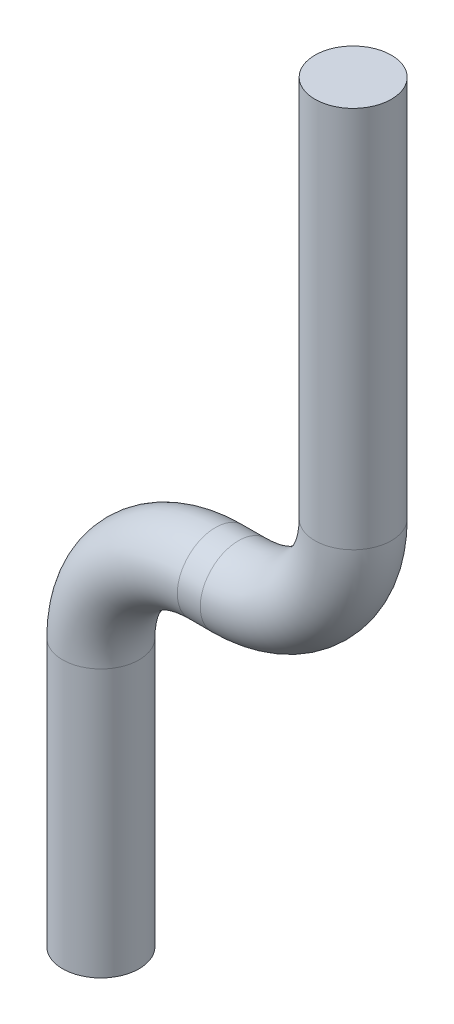
ISO-10303-21;
HEADER;
FILE_DESCRIPTION(('STEP AP214'),'2;1');
FILE_NAME('part.step','',(''),(''),'','','');
FILE_SCHEMA(('AUTOMOTIVE_DESIGN { 1 0 10303 214 1 1 1 1 }'));
ENDSEC;
DATA;
#1=APPLICATION_CONTEXT('core data for automotive mechanical design processes');
#2=APPLICATION_PROTOCOL_DEFINITION('international standard','automotive_design',2000,#1);
#3=PRODUCT_CONTEXT('',#1,'mechanical');
#4=PRODUCT('Part','Part','',(#3));
#5=PRODUCT_RELATED_PRODUCT_CATEGORY('part','',(#4));
#6=PRODUCT_DEFINITION_FORMATION('','',#4);
#7=PRODUCT_DEFINITION_CONTEXT('part definition',#1,'design');
#8=PRODUCT_DEFINITION('design','',#6,#7);
#9=PRODUCT_DEFINITION_SHAPE('','',#8);
#10=(LENGTH_UNIT() NAMED_UNIT(*) SI_UNIT(.MILLI.,.METRE.));
#11=(NAMED_UNIT(*) PLANE_ANGLE_UNIT() SI_UNIT($,.RADIAN.));
#12=(NAMED_UNIT(*) SI_UNIT($,.STERADIAN.) SOLID_ANGLE_UNIT());
#13=UNCERTAINTY_MEASURE_WITH_UNIT(LENGTH_MEASURE(1.E-05),#10,'distance_accuracy_value','');
#14=(GEOMETRIC_REPRESENTATION_CONTEXT(3) GLOBAL_UNCERTAINTY_ASSIGNED_CONTEXT((#13)) GLOBAL_UNIT_ASSIGNED_CONTEXT((#10,
#11,#12)) REPRESENTATION_CONTEXT('',''));
#15=CARTESIAN_POINT('',(0.,0.,0.));
#16=DIRECTION('',(0.,0.,1.));
#17=DIRECTION('',(1.,0.,0.));
#18=AXIS2_PLACEMENT_3D('',#15,#16,#17);
#19=CARTESIAN_POINT('',(-66.790624116483,-3.60687022900763,0.));
#20=DIRECTION('',(0.,-1.,0.));
#21=DIRECTION('',(0.,0.,-1.));
#22=AXIS2_PLACEMENT_3D('',#19,#20,#21);
#23=PLANE('',#22);
#24=CARTESIAN_POINT('',(-66.790624116483,-3.60687022900763,0.));
#25=DIRECTION('',(0.,-1.,0.));
#26=DIRECTION('',(0.,0.,-1.));
#27=AXIS2_PLACEMENT_3D('',#24,#25,#26);
#28=CIRCLE('',#27,5.);
#29=CARTESIAN_POINT('',(-66.790624116483,-3.60687022900763,-5.));
#30=VERTEX_POINT('',#29);
#31=EDGE_CURVE('E59',#30,#30,#28,.T.);
#32=ORIENTED_EDGE('',*,*,#31,.T.);
#33=EDGE_LOOP('',(#32));
#34=FACE_BOUND('',#33,.T.);
#35=ADVANCED_FACE('F37',(#34),#23,.T.);
#36=CARTESIAN_POINT('',(-33.790624116483,111.393129770992,0.));
#37=DIRECTION('',(0.,-1.,0.));
#38=DIRECTION('',(0.,0.,-1.));
#39=AXIS2_PLACEMENT_3D('',#36,#37,#38);
#40=PLANE('',#39);
#41=CARTESIAN_POINT('',(-33.790624116483,111.393129770992,0.));
#42=DIRECTION('',(0.,-1.,0.));
#43=DIRECTION('',(0.,0.,-1.));
#44=AXIS2_PLACEMENT_3D('',#41,#42,#43);
#45=CIRCLE('',#44,5.);
#46=CARTESIAN_POINT('',(-33.790624116483,111.393129770992,-5.));
#47=VERTEX_POINT('',#46);
#48=EDGE_CURVE('E10',#47,#47,#45,.T.);
#49=ORIENTED_EDGE('',*,*,#48,.F.);
#50=EDGE_LOOP('',(#49));
#51=FACE_BOUND('',#50,.T.);
#52=ADVANCED_FACE('F67',(#51),#40,.F.);
#53=CARTESIAN_POINT('',(-66.790624116483,-3.60687022900763,0.));
#54=DIRECTION('',(0.,1.,0.));
#55=DIRECTION('',(0.,0.,1.));
#56=AXIS2_PLACEMENT_3D('',#53,#54,#55);
#57=CYLINDRICAL_SURFACE('',#56,5.);
#58=CARTESIAN_POINT('',(-66.790624116483,31.3931297709923,0.));
#59=DIRECTION('',(0.,-1.,0.));
#60=DIRECTION('',(0.,0.,-1.));
#61=AXIS2_PLACEMENT_3D('',#58,#59,#60);
#62=CIRCLE('',#61,5.);
#63=CARTESIAN_POINT('',(-71.790624116483,31.3931297709922,0.));
#64=VERTEX_POINT('',#63);
#65=EDGE_CURVE('E56',#64,#64,#62,.T.);
#66=ORIENTED_EDGE('',*,*,#65,.T.);
#67=EDGE_LOOP('',(#66));
#68=FACE_BOUND('',#67,.T.);
#69=ORIENTED_EDGE('',*,*,#31,.F.);
#70=EDGE_LOOP('',(#69));
#71=FACE_BOUND('',#70,.T.);
#72=ADVANCED_FACE('F64',(#68,#71),#57,.T.);
#73=CARTESIAN_POINT('',(-51.790624116483,31.3931297709924,0.));
#74=DIRECTION('',(0.,0.,-1.));
#75=DIRECTION('',(-1.,0.,0.));
#76=AXIS2_PLACEMENT_3D('',#73,#74,#75);
#77=TOROIDAL_SURFACE('',#76,15.,5.);
#78=CARTESIAN_POINT('',(-51.7906241164829,46.3931297709924,0.));
#79=DIRECTION('',(-1.,0.,0.));
#80=DIRECTION('',(0.,0.,-1.));
#81=AXIS2_PLACEMENT_3D('',#78,#79,#80);
#82=CIRCLE('',#81,5.);
#83=CARTESIAN_POINT('',(-51.7906241164828,51.3931297709924,0.));
#84=VERTEX_POINT('',#83);
#85=EDGE_CURVE('E51',#84,#84,#82,.T.);
#86=CARTESIAN_POINT('',(-51.790624116483,31.3931297709924,0.));
#87=DIRECTION('',(0.,0.,-1.));
#88=DIRECTION('',(-1.,0.,0.));
#89=AXIS2_PLACEMENT_3D('',#86,#87,#88);
#90=CIRCLE('',#89,20.);
#91=EDGE_CURVE('',#64,#84,#90,.T.);
#92=ORIENTED_EDGE('',*,*,#65,.F.);
#93=ORIENTED_EDGE('',*,*,#85,.T.);
#94=ORIENTED_EDGE('',*,*,#91,.T.);
#95=ORIENTED_EDGE('',*,*,#91,.F.);
#96=EDGE_LOOP('',(#92,#94,#93,#95));
#97=FACE_BOUND('',#96,.T.);
#98=ADVANCED_FACE('F66',(#97),#77,.T.);
#99=CARTESIAN_POINT('',(-51.7906241164829,46.3931297709924,0.));
#100=DIRECTION('',(1.,0.,0.));
#101=DIRECTION('',(0.,0.,-1.));
#102=AXIS2_PLACEMENT_3D('',#99,#100,#101);
#103=CYLINDRICAL_SURFACE('',#102,5.);
#104=CARTESIAN_POINT('',(-48.7906241164831,46.3931297709924,0.));
#105=DIRECTION('',(-1.,0.,0.));
#106=DIRECTION('',(0.,0.,-1.));
#107=AXIS2_PLACEMENT_3D('',#104,#105,#106);
#108=CIRCLE('',#107,5.);
#109=CARTESIAN_POINT('',(-48.7906241164831,41.3931297709924,0.));
#110=VERTEX_POINT('',#109);
#111=EDGE_CURVE('E47',#110,#110,#108,.T.);
#112=ORIENTED_EDGE('',*,*,#111,.T.);
#113=EDGE_LOOP('',(#112));
#114=FACE_BOUND('',#113,.T.);
#115=ORIENTED_EDGE('',*,*,#85,.F.);
#116=EDGE_LOOP('',(#115));
#117=FACE_BOUND('',#116,.T.);
#118=ADVANCED_FACE('F74',(#114,#117),#103,.T.);
#119=CARTESIAN_POINT('',(-48.790624116483,61.3931297709924,0.));
#120=DIRECTION('',(0.,0.,1.));
#121=DIRECTION('',(1.,0.,0.));
#122=AXIS2_PLACEMENT_3D('',#119,#120,#121);
#123=TOROIDAL_SURFACE('',#122,15.,5.);
#124=CARTESIAN_POINT('',(-33.790624116483,61.3931297709924,0.));
#125=DIRECTION('',(0.,-1.,0.));
#126=DIRECTION('',(0.,0.,-1.));
#127=AXIS2_PLACEMENT_3D('',#124,#125,#126);
#128=CIRCLE('',#127,5.);
#129=CARTESIAN_POINT('',(-28.790624116483,61.3931297709924,0.));
#130=VERTEX_POINT('',#129);
#131=EDGE_CURVE('E43',#130,#130,#128,.T.);
#132=CARTESIAN_POINT('',(-48.790624116483,61.3931297709924,0.));
#133=DIRECTION('',(0.,0.,1.));
#134=DIRECTION('',(1.,0.,0.));
#135=AXIS2_PLACEMENT_3D('',#132,#133,#134);
#136=CIRCLE('',#135,20.);
#137=EDGE_CURVE('',#110,#130,#136,.T.);
#138=ORIENTED_EDGE('',*,*,#111,.F.);
#139=ORIENTED_EDGE('',*,*,#131,.T.);
#140=ORIENTED_EDGE('',*,*,#137,.T.);
#141=ORIENTED_EDGE('',*,*,#137,.F.);
#142=EDGE_LOOP('',(#138,#140,#139,#141));
#143=FACE_BOUND('',#142,.T.);
#144=ADVANCED_FACE('F80',(#143),#123,.T.);
#145=CARTESIAN_POINT('',(-33.790624116483,61.3931297709924,0.));
#146=DIRECTION('',(0.,1.,0.));
#147=DIRECTION('',(0.,0.,1.));
#148=AXIS2_PLACEMENT_3D('',#145,#146,#147);
#149=CYLINDRICAL_SURFACE('',#148,5.);
#150=ORIENTED_EDGE('',*,*,#48,.T.);
#151=EDGE_LOOP('',(#150));
#152=FACE_BOUND('',#151,.T.);
#153=ORIENTED_EDGE('',*,*,#131,.F.);
#154=EDGE_LOOP('',(#153));
#155=FACE_BOUND('',#154,.T.);
#156=ADVANCED_FACE('F78',(#152,#155),#149,.T.);
#157=CLOSED_SHELL('',(#35,#52,#72,#98,#118,#144,#156));
#158=MANIFOLD_SOLID_BREP('B2',#157);
#159=ADVANCED_BREP_SHAPE_REPRESENTATION('',(#18,#158),#14);
#160=SHAPE_DEFINITION_REPRESENTATION(#9,#159);
ENDSEC;
END-ISO-10303-21;
